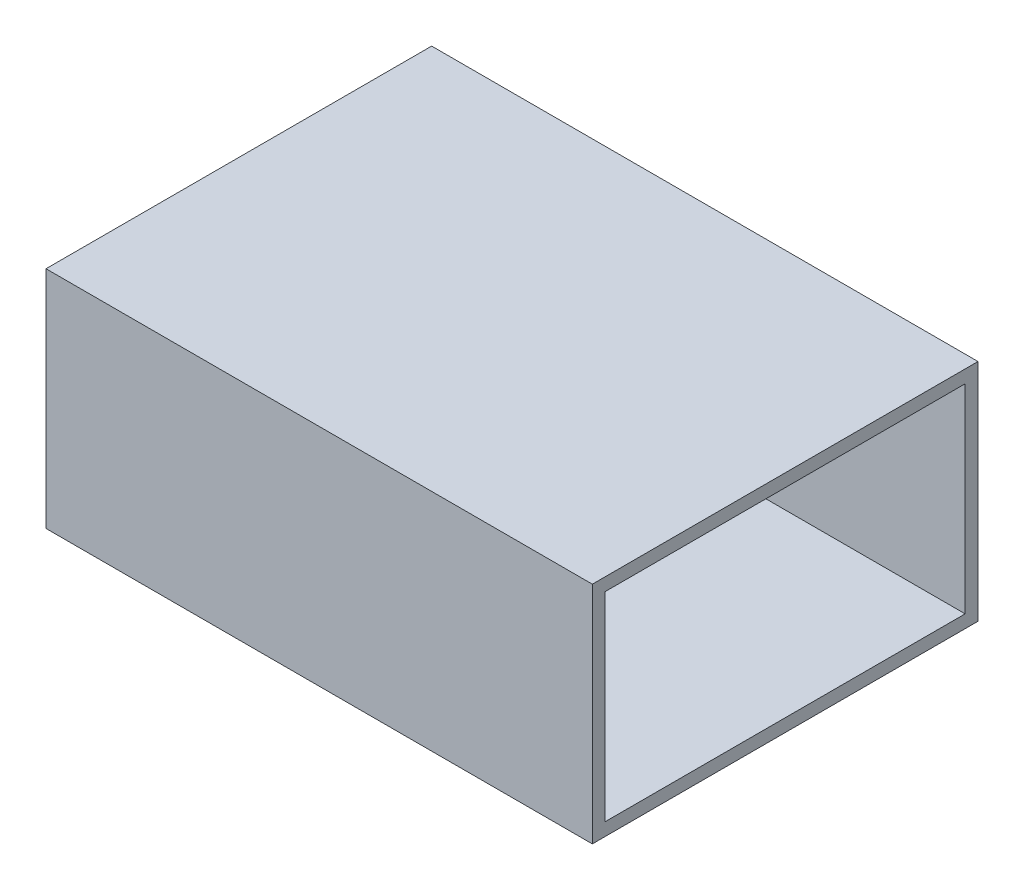
ISO-10303-21;
HEADER;
FILE_DESCRIPTION(('STEP AP214'),'2;1');
FILE_NAME('part.step','',(''),(''),'','','');
FILE_SCHEMA(('AUTOMOTIVE_DESIGN { 1 0 10303 214 1 1 1 1 }'));
ENDSEC;
DATA;
#1=APPLICATION_CONTEXT('core data for automotive mechanical design processes');
#2=APPLICATION_PROTOCOL_DEFINITION('international standard','automotive_design',2000,#1);
#3=PRODUCT_CONTEXT('',#1,'mechanical');
#4=PRODUCT('Part','Part','',(#3));
#5=PRODUCT_RELATED_PRODUCT_CATEGORY('part','',(#4));
#6=PRODUCT_DEFINITION_FORMATION('','',#4);
#7=PRODUCT_DEFINITION_CONTEXT('part definition',#1,'design');
#8=PRODUCT_DEFINITION('design','',#6,#7);
#9=PRODUCT_DEFINITION_SHAPE('','',#8);
#10=(LENGTH_UNIT() NAMED_UNIT(*) SI_UNIT(.MILLI.,.METRE.));
#11=(NAMED_UNIT(*) PLANE_ANGLE_UNIT() SI_UNIT($,.RADIAN.));
#12=(NAMED_UNIT(*) SI_UNIT($,.STERADIAN.) SOLID_ANGLE_UNIT());
#13=UNCERTAINTY_MEASURE_WITH_UNIT(LENGTH_MEASURE(1.E-05),#10,'distance_accuracy_value','');
#14=(GEOMETRIC_REPRESENTATION_CONTEXT(3) GLOBAL_UNCERTAINTY_ASSIGNED_CONTEXT((#13)) GLOBAL_UNIT_ASSIGNED_CONTEXT((#10,
#11,#12)) REPRESENTATION_CONTEXT('',''));
#15=CARTESIAN_POINT('',(0.,0.,0.));
#16=DIRECTION('',(0.,0.,1.));
#17=DIRECTION('',(1.,0.,0.));
#18=AXIS2_PLACEMENT_3D('',#15,#16,#17);
#19=CARTESIAN_POINT('',(42.5,35.,30.));
#20=DIRECTION('',(-1.,0.,0.));
#21=DIRECTION('',(0.,0.,1.));
#22=AXIS2_PLACEMENT_3D('',#19,#20,#21);
#23=PLANE('',#22);
#24=DIRECTION('',(0.,0.,-1.));
#25=VECTOR('',#24,1.);
#26=CARTESIAN_POINT('',(42.5,2.,28.));
#27=LINE('',#26,#25);
#28=CARTESIAN_POINT('',(42.5,2.,28.));
#29=VERTEX_POINT('',#28);
#30=CARTESIAN_POINT('',(42.5,2.,-28.));
#31=VERTEX_POINT('',#30);
#32=EDGE_CURVE('E135',#29,#31,#27,.T.);
#33=ORIENTED_EDGE('',*,*,#32,.F.);
#34=DIRECTION('',(0.,-1.,0.));
#35=VECTOR('',#34,1.);
#36=CARTESIAN_POINT('',(42.5,2.,28.));
#37=LINE('',#36,#35);
#38=CARTESIAN_POINT('',(42.5,33.,28.));
#39=VERTEX_POINT('',#38);
#40=EDGE_CURVE('E47',#39,#29,#37,.T.);
#41=ORIENTED_EDGE('',*,*,#40,.F.);
#42=DIRECTION('',(0.,0.,1.));
#43=VECTOR('',#42,1.);
#44=CARTESIAN_POINT('',(42.5,33.,28.));
#45=LINE('',#44,#43);
#46=CARTESIAN_POINT('',(42.5,33.,-28.));
#47=VERTEX_POINT('',#46);
#48=EDGE_CURVE('E126',#47,#39,#45,.T.);
#49=ORIENTED_EDGE('',*,*,#48,.F.);
#50=DIRECTION('',(0.,1.,0.));
#51=VECTOR('',#50,1.);
#52=CARTESIAN_POINT('',(42.5,2.,-28.));
#53=LINE('',#52,#51);
#54=EDGE_CURVE('E129',#31,#47,#53,.T.);
#55=ORIENTED_EDGE('',*,*,#54,.F.);
#56=EDGE_LOOP('',(#33,#41,#49,#55));
#57=FACE_BOUND('',#56,.T.);
#58=DIRECTION('',(0.,0.,-1.));
#59=VECTOR('',#58,1.);
#60=CARTESIAN_POINT('',(42.5,0.,30.));
#61=LINE('',#60,#59);
#62=CARTESIAN_POINT('',(42.5,0.,30.));
#63=VERTEX_POINT('',#62);
#64=CARTESIAN_POINT('',(42.5,0.,-30.));
#65=VERTEX_POINT('',#64);
#66=EDGE_CURVE('E141',#63,#65,#61,.T.);
#67=ORIENTED_EDGE('',*,*,#66,.T.);
#68=DIRECTION('',(0.,-1.,0.));
#69=VECTOR('',#68,1.);
#70=CARTESIAN_POINT('',(42.5,35.,-30.));
#71=LINE('',#70,#69);
#72=CARTESIAN_POINT('',(42.5,35.,-30.));
#73=VERTEX_POINT('',#72);
#74=EDGE_CURVE('E11',#73,#65,#71,.T.);
#75=ORIENTED_EDGE('',*,*,#74,.F.);
#76=DIRECTION('',(0.,0.,-1.));
#77=VECTOR('',#76,1.);
#78=CARTESIAN_POINT('',(42.5,35.,30.));
#79=LINE('',#78,#77);
#80=CARTESIAN_POINT('',(42.5,35.,30.));
#81=VERTEX_POINT('',#80);
#82=EDGE_CURVE('E145',#81,#73,#79,.T.);
#83=ORIENTED_EDGE('',*,*,#82,.F.);
#84=DIRECTION('',(0.,-1.,0.));
#85=VECTOR('',#84,1.);
#86=CARTESIAN_POINT('',(42.5,35.,30.));
#87=LINE('',#86,#85);
#88=EDGE_CURVE('E151',#81,#63,#87,.T.);
#89=ORIENTED_EDGE('',*,*,#88,.T.);
#90=EDGE_LOOP('',(#67,#75,#83,#89));
#91=FACE_BOUND('',#90,.T.);
#92=ADVANCED_FACE('F33',(#57,#91),#23,.F.);
#93=CARTESIAN_POINT('',(-42.5,35.,-30.));
#94=DIRECTION('',(0.,0.,1.));
#95=DIRECTION('',(1.,0.,0.));
#96=AXIS2_PLACEMENT_3D('',#93,#94,#95);
#97=PLANE('',#96);
#98=DIRECTION('',(-1.,0.,0.));
#99=VECTOR('',#98,1.);
#100=CARTESIAN_POINT('',(-42.5,0.,-30.));
#101=LINE('',#100,#99);
#102=CARTESIAN_POINT('',(-42.5,0.,-30.));
#103=VERTEX_POINT('',#102);
#104=EDGE_CURVE('E154',#65,#103,#101,.T.);
#105=ORIENTED_EDGE('',*,*,#104,.T.);
#106=DIRECTION('',(0.,-1.,0.));
#107=VECTOR('',#106,1.);
#108=CARTESIAN_POINT('',(-42.5,35.,-30.));
#109=LINE('',#108,#107);
#110=CARTESIAN_POINT('',(-42.5,35.,-30.));
#111=VERTEX_POINT('',#110);
#112=EDGE_CURVE('E40',#111,#103,#109,.T.);
#113=ORIENTED_EDGE('',*,*,#112,.F.);
#114=DIRECTION('',(-1.,0.,0.));
#115=VECTOR('',#114,1.);
#116=CARTESIAN_POINT('',(-42.5,35.,-30.));
#117=LINE('',#116,#115);
#118=EDGE_CURVE('E84',#73,#111,#117,.T.);
#119=ORIENTED_EDGE('',*,*,#118,.F.);
#120=ORIENTED_EDGE('',*,*,#74,.T.);
#121=EDGE_LOOP('',(#105,#113,#119,#120));
#122=FACE_BOUND('',#121,.T.);
#123=ADVANCED_FACE('F182',(#122),#97,.F.);
#124=CARTESIAN_POINT('',(-42.5,35.,30.));
#125=DIRECTION('',(1.,0.,0.));
#126=DIRECTION('',(0.,0.,-1.));
#127=AXIS2_PLACEMENT_3D('',#124,#125,#126);
#128=PLANE('',#127);
#129=DIRECTION('',(0.,0.,1.));
#130=VECTOR('',#129,1.);
#131=CARTESIAN_POINT('',(-42.5,0.,30.));
#132=LINE('',#131,#130);
#133=CARTESIAN_POINT('',(-42.5,0.,30.));
#134=VERTEX_POINT('',#133);
#135=EDGE_CURVE('E156',#103,#134,#132,.T.);
#136=ORIENTED_EDGE('',*,*,#135,.T.);
#137=DIRECTION('',(0.,-1.,0.));
#138=VECTOR('',#137,1.);
#139=CARTESIAN_POINT('',(-42.5,35.,30.));
#140=LINE('',#139,#138);
#141=CARTESIAN_POINT('',(-42.5,35.,30.));
#142=VERTEX_POINT('',#141);
#143=EDGE_CURVE('E160',#142,#134,#140,.T.);
#144=ORIENTED_EDGE('',*,*,#143,.F.);
#145=DIRECTION('',(0.,0.,1.));
#146=VECTOR('',#145,1.);
#147=CARTESIAN_POINT('',(-42.5,35.,30.));
#148=LINE('',#147,#146);
#149=EDGE_CURVE('E148',#111,#142,#148,.T.);
#150=ORIENTED_EDGE('',*,*,#149,.F.);
#151=ORIENTED_EDGE('',*,*,#112,.T.);
#152=EDGE_LOOP('',(#136,#144,#150,#151));
#153=FACE_BOUND('',#152,.T.);
#154=ADVANCED_FACE('F165',(#153),#128,.F.);
#155=CARTESIAN_POINT('',(-42.5,35.,30.));
#156=DIRECTION('',(0.,0.,-1.));
#157=DIRECTION('',(-1.,0.,0.));
#158=AXIS2_PLACEMENT_3D('',#155,#156,#157);
#159=PLANE('',#158);
#160=DIRECTION('',(1.,0.,0.));
#161=VECTOR('',#160,1.);
#162=CARTESIAN_POINT('',(-42.5,0.,30.));
#163=LINE('',#162,#161);
#164=EDGE_CURVE('E77',#134,#63,#163,.T.);
#165=ORIENTED_EDGE('',*,*,#164,.T.);
#166=ORIENTED_EDGE('',*,*,#88,.F.);
#167=DIRECTION('',(1.,0.,0.));
#168=VECTOR('',#167,1.);
#169=CARTESIAN_POINT('',(-42.5,35.,30.));
#170=LINE('',#169,#168);
#171=EDGE_CURVE('E56',#142,#81,#170,.T.);
#172=ORIENTED_EDGE('',*,*,#171,.F.);
#173=ORIENTED_EDGE('',*,*,#143,.T.);
#174=EDGE_LOOP('',(#165,#166,#172,#173));
#175=FACE_BOUND('',#174,.T.);
#176=ADVANCED_FACE('F173',(#175),#159,.F.);
#177=CARTESIAN_POINT('',(0.,35.,0.));
#178=DIRECTION('',(0.,-1.,0.));
#179=DIRECTION('',(0.,0.,-1.));
#180=AXIS2_PLACEMENT_3D('',#177,#178,#179);
#181=PLANE('',#180);
#182=ORIENTED_EDGE('',*,*,#82,.T.);
#183=ORIENTED_EDGE('',*,*,#118,.T.);
#184=ORIENTED_EDGE('',*,*,#149,.T.);
#185=ORIENTED_EDGE('',*,*,#171,.T.);
#186=EDGE_LOOP('',(#182,#183,#184,#185));
#187=FACE_BOUND('',#186,.T.);
#188=ADVANCED_FACE('F175',(#187),#181,.F.);
#189=CARTESIAN_POINT('',(0.,0.,0.));
#190=DIRECTION('',(0.,-1.,0.));
#191=DIRECTION('',(0.,0.,-1.));
#192=AXIS2_PLACEMENT_3D('',#189,#190,#191);
#193=PLANE('',#192);
#194=ORIENTED_EDGE('',*,*,#66,.F.);
#195=ORIENTED_EDGE('',*,*,#164,.F.);
#196=ORIENTED_EDGE('',*,*,#135,.F.);
#197=ORIENTED_EDGE('',*,*,#104,.F.);
#198=EDGE_LOOP('',(#194,#195,#196,#197));
#199=FACE_BOUND('',#198,.T.);
#200=ADVANCED_FACE('F169',(#199),#193,.T.);
#201=CARTESIAN_POINT('',(-37.5,2.,28.));
#202=DIRECTION('',(0.,0.,1.));
#203=DIRECTION('',(1.,0.,0.));
#204=AXIS2_PLACEMENT_3D('',#201,#202,#203);
#205=PLANE('',#204);
#206=ORIENTED_EDGE('',*,*,#40,.T.);
#207=DIRECTION('',(1.,0.,0.));
#208=VECTOR('',#207,1.);
#209=CARTESIAN_POINT('',(-37.5,2.,28.));
#210=LINE('',#209,#208);
#211=CARTESIAN_POINT('',(-37.5,2.,28.));
#212=VERTEX_POINT('',#211);
#213=EDGE_CURVE('E104',#212,#29,#210,.T.);
#214=ORIENTED_EDGE('',*,*,#213,.F.);
#215=DIRECTION('',(0.,-1.,0.));
#216=VECTOR('',#215,1.);
#217=CARTESIAN_POINT('',(-37.5,2.,28.));
#218=LINE('',#217,#216);
#219=CARTESIAN_POINT('',(-37.5,33.,28.));
#220=VERTEX_POINT('',#219);
#221=EDGE_CURVE('E108',#220,#212,#218,.T.);
#222=ORIENTED_EDGE('',*,*,#221,.F.);
#223=DIRECTION('',(1.,0.,0.));
#224=VECTOR('',#223,1.);
#225=CARTESIAN_POINT('',(-37.5,33.,28.));
#226=LINE('',#225,#224);
#227=EDGE_CURVE('E139',#220,#39,#226,.T.);
#228=ORIENTED_EDGE('',*,*,#227,.T.);
#229=EDGE_LOOP('',(#206,#214,#222,#228));
#230=FACE_BOUND('',#229,.T.);
#231=ADVANCED_FACE('F106',(#230),#205,.F.);
#232=CARTESIAN_POINT('',(-37.5,33.,28.));
#233=DIRECTION('',(0.,1.,0.));
#234=DIRECTION('',(0.,0.,1.));
#235=AXIS2_PLACEMENT_3D('',#232,#233,#234);
#236=PLANE('',#235);
#237=ORIENTED_EDGE('',*,*,#48,.T.);
#238=ORIENTED_EDGE('',*,*,#227,.F.);
#239=DIRECTION('',(0.,0.,1.));
#240=VECTOR('',#239,1.);
#241=CARTESIAN_POINT('',(-37.5,33.,28.));
#242=LINE('',#241,#240);
#243=CARTESIAN_POINT('',(-37.5,33.,-28.));
#244=VERTEX_POINT('',#243);
#245=EDGE_CURVE('E114',#244,#220,#242,.T.);
#246=ORIENTED_EDGE('',*,*,#245,.F.);
#247=DIRECTION('',(1.,0.,0.));
#248=VECTOR('',#247,1.);
#249=CARTESIAN_POINT('',(-37.5,33.,-28.));
#250=LINE('',#249,#248);
#251=EDGE_CURVE('E142',#244,#47,#250,.T.);
#252=ORIENTED_EDGE('',*,*,#251,.T.);
#253=EDGE_LOOP('',(#237,#238,#246,#252));
#254=FACE_BOUND('',#253,.T.);
#255=ADVANCED_FACE('F197',(#254),#236,.F.);
#256=CARTESIAN_POINT('',(-37.5,2.,-28.));
#257=DIRECTION('',(0.,0.,-1.));
#258=DIRECTION('',(0.,1.,0.));
#259=AXIS2_PLACEMENT_3D('',#256,#257,#258);
#260=PLANE('',#259);
#261=ORIENTED_EDGE('',*,*,#54,.T.);
#262=ORIENTED_EDGE('',*,*,#251,.F.);
#263=DIRECTION('',(0.,1.,0.));
#264=VECTOR('',#263,1.);
#265=CARTESIAN_POINT('',(-37.5,2.,-28.));
#266=LINE('',#265,#264);
#267=CARTESIAN_POINT('',(-37.5,2.,-28.));
#268=VERTEX_POINT('',#267);
#269=EDGE_CURVE('E122',#268,#244,#266,.T.);
#270=ORIENTED_EDGE('',*,*,#269,.F.);
#271=DIRECTION('',(1.,0.,0.));
#272=VECTOR('',#271,1.);
#273=CARTESIAN_POINT('',(-37.5,2.,-28.));
#274=LINE('',#273,#272);
#275=EDGE_CURVE('E113',#268,#31,#274,.T.);
#276=ORIENTED_EDGE('',*,*,#275,.T.);
#277=EDGE_LOOP('',(#261,#262,#270,#276));
#278=FACE_BOUND('',#277,.T.);
#279=ADVANCED_FACE('F195',(#278),#260,.F.);
#280=CARTESIAN_POINT('',(-37.5,2.,28.));
#281=DIRECTION('',(0.,-1.,0.));
#282=DIRECTION('',(0.,0.,-1.));
#283=AXIS2_PLACEMENT_3D('',#280,#281,#282);
#284=PLANE('',#283);
#285=ORIENTED_EDGE('',*,*,#32,.T.);
#286=ORIENTED_EDGE('',*,*,#275,.F.);
#287=DIRECTION('',(0.,0.,-1.));
#288=VECTOR('',#287,1.);
#289=CARTESIAN_POINT('',(-37.5,2.,28.));
#290=LINE('',#289,#288);
#291=EDGE_CURVE('E117',#212,#268,#290,.T.);
#292=ORIENTED_EDGE('',*,*,#291,.F.);
#293=ORIENTED_EDGE('',*,*,#213,.T.);
#294=EDGE_LOOP('',(#285,#286,#292,#293));
#295=FACE_BOUND('',#294,.T.);
#296=ADVANCED_FACE('F118',(#295),#284,.F.);
#297=CARTESIAN_POINT('',(-37.5,0.,0.));
#298=DIRECTION('',(-1.,0.,0.));
#299=DIRECTION('',(0.,0.,1.));
#300=AXIS2_PLACEMENT_3D('',#297,#298,#299);
#301=PLANE('',#300);
#302=ORIENTED_EDGE('',*,*,#221,.T.);
#303=ORIENTED_EDGE('',*,*,#291,.T.);
#304=ORIENTED_EDGE('',*,*,#269,.T.);
#305=ORIENTED_EDGE('',*,*,#245,.T.);
#306=EDGE_LOOP('',(#302,#303,#304,#305));
#307=FACE_BOUND('',#306,.T.);
#308=ADVANCED_FACE('F124',(#307),#301,.F.);
#309=CLOSED_SHELL('',(#92,#123,#154,#176,#188,#200,#231,#255,#279,#296,#308));
#310=MANIFOLD_SOLID_BREP('B2',#309);
#311=ADVANCED_BREP_SHAPE_REPRESENTATION('',(#18,#310),#14);
#312=SHAPE_DEFINITION_REPRESENTATION(#9,#311);
ENDSEC;
END-ISO-10303-21;
